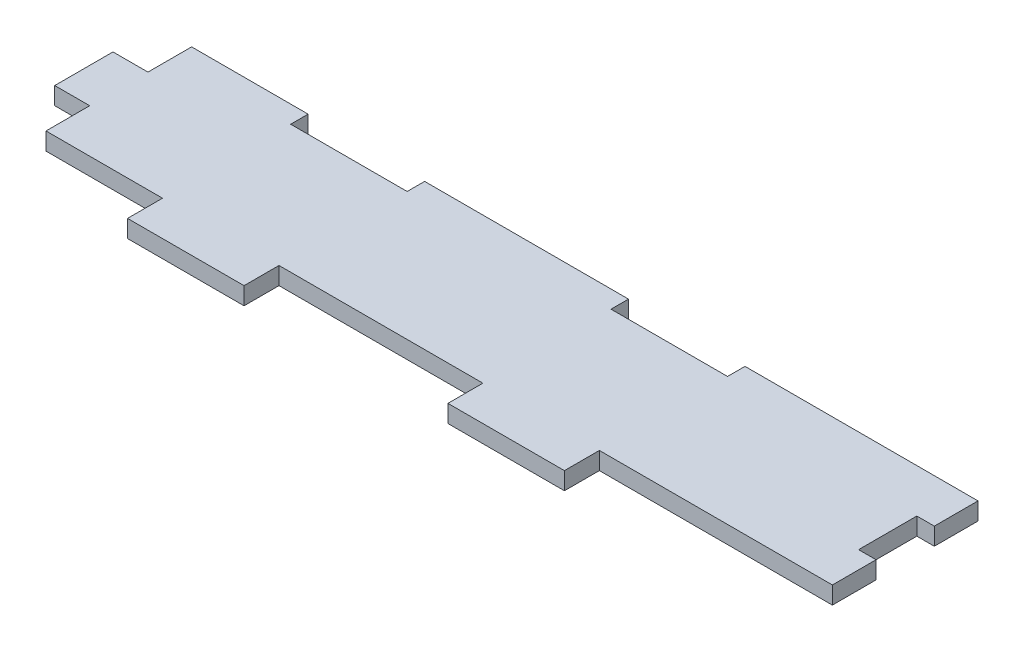
ISO-10303-21;
HEADER;
FILE_DESCRIPTION(('STEP AP214'),'2;1');
FILE_NAME('part.step','',(''),(''),'','','');
FILE_SCHEMA(('AUTOMOTIVE_DESIGN { 1 0 10303 214 1 1 1 1 }'));
ENDSEC;
DATA;
#1=APPLICATION_CONTEXT('core data for automotive mechanical design processes');
#2=APPLICATION_PROTOCOL_DEFINITION('international standard','automotive_design',2000,#1);
#3=PRODUCT_CONTEXT('',#1,'mechanical');
#4=PRODUCT('Part','Part','',(#3));
#5=PRODUCT_RELATED_PRODUCT_CATEGORY('part','',(#4));
#6=PRODUCT_DEFINITION_FORMATION('','',#4);
#7=PRODUCT_DEFINITION_CONTEXT('part definition',#1,'design');
#8=PRODUCT_DEFINITION('design','',#6,#7);
#9=PRODUCT_DEFINITION_SHAPE('','',#8);
#10=(LENGTH_UNIT() NAMED_UNIT(*) SI_UNIT(.MILLI.,.METRE.));
#11=(NAMED_UNIT(*) PLANE_ANGLE_UNIT() SI_UNIT($,.RADIAN.));
#12=(NAMED_UNIT(*) SI_UNIT($,.STERADIAN.) SOLID_ANGLE_UNIT());
#13=UNCERTAINTY_MEASURE_WITH_UNIT(LENGTH_MEASURE(1.E-05),#10,'distance_accuracy_value','');
#14=(GEOMETRIC_REPRESENTATION_CONTEXT(3) GLOBAL_UNCERTAINTY_ASSIGNED_CONTEXT((#13)) GLOBAL_UNIT_ASSIGNED_CONTEXT((#10,
#11,#12)) REPRESENTATION_CONTEXT('',''));
#15=CARTESIAN_POINT('',(0.,0.,0.));
#16=DIRECTION('',(0.,0.,1.));
#17=DIRECTION('',(1.,0.,0.));
#18=AXIS2_PLACEMENT_3D('',#15,#16,#17);
#19=CARTESIAN_POINT('',(0.,3.,0.));
#20=DIRECTION('',(1.,0.,0.));
#21=DIRECTION('',(0.,0.,-1.));
#22=AXIS2_PLACEMENT_3D('',#19,#20,#21);
#23=PLANE('',#22);
#24=DIRECTION('',(0.,0.,1.));
#25=VECTOR('',#24,1.);
#26=CARTESIAN_POINT('',(0.,0.,0.));
#27=LINE('',#26,#25);
#28=CARTESIAN_POINT('',(0.,0.,-7.49999999999998));
#29=VERTEX_POINT('',#28);
#30=CARTESIAN_POINT('',(0.,0.,0.));
#31=VERTEX_POINT('',#30);
#32=EDGE_CURVE('E260',#29,#31,#27,.T.);
#33=ORIENTED_EDGE('',*,*,#32,.T.);
#34=DIRECTION('',(0.,-1.,0.));
#35=VECTOR('',#34,1.);
#36=CARTESIAN_POINT('',(0.,3.,0.));
#37=LINE('',#36,#35);
#38=CARTESIAN_POINT('',(0.,3.,0.));
#39=VERTEX_POINT('',#38);
#40=EDGE_CURVE('E11',#39,#31,#37,.T.);
#41=ORIENTED_EDGE('',*,*,#40,.F.);
#42=DIRECTION('',(0.,0.,1.));
#43=VECTOR('',#42,1.);
#44=CARTESIAN_POINT('',(0.,3.,0.));
#45=LINE('',#44,#43);
#46=CARTESIAN_POINT('',(0.,3.,-7.49999999999998));
#47=VERTEX_POINT('',#46);
#48=EDGE_CURVE('E342',#47,#39,#45,.T.);
#49=ORIENTED_EDGE('',*,*,#48,.F.);
#50=DIRECTION('',(0.,-1.,0.));
#51=VECTOR('',#50,1.);
#52=CARTESIAN_POINT('',(0.,3.,-7.49999999999998));
#53=LINE('',#52,#51);
#54=EDGE_CURVE('E256',#47,#29,#53,.T.);
#55=ORIENTED_EDGE('',*,*,#54,.T.);
#56=EDGE_LOOP('',(#33,#41,#49,#55));
#57=FACE_BOUND('',#56,.T.);
#58=ADVANCED_FACE('F39',(#57),#23,.F.);
#59=CARTESIAN_POINT('',(0.,3.,0.));
#60=DIRECTION('',(0.,0.,-1.));
#61=DIRECTION('',(-1.,0.,0.));
#62=AXIS2_PLACEMENT_3D('',#59,#60,#61);
#63=PLANE('',#62);
#64=DIRECTION('',(1.,0.,0.));
#65=VECTOR('',#64,1.);
#66=CARTESIAN_POINT('',(0.,0.,0.));
#67=LINE('',#66,#65);
#68=CARTESIAN_POINT('',(20.,0.,0.));
#69=VERTEX_POINT('',#68);
#70=EDGE_CURVE('E264',#31,#69,#67,.T.);
#71=ORIENTED_EDGE('',*,*,#70,.T.);
#72=DIRECTION('',(0.,-1.,0.));
#73=VECTOR('',#72,1.);
#74=CARTESIAN_POINT('',(20.,3.,0.));
#75=LINE('',#74,#73);
#76=CARTESIAN_POINT('',(20.,3.,0.));
#77=VERTEX_POINT('',#76);
#78=EDGE_CURVE('E48',#77,#69,#75,.T.);
#79=ORIENTED_EDGE('',*,*,#78,.F.);
#80=DIRECTION('',(1.,0.,0.));
#81=VECTOR('',#80,1.);
#82=CARTESIAN_POINT('',(0.,3.,0.));
#83=LINE('',#82,#81);
#84=EDGE_CURVE('E159',#39,#77,#83,.T.);
#85=ORIENTED_EDGE('',*,*,#84,.F.);
#86=ORIENTED_EDGE('',*,*,#40,.T.);
#87=EDGE_LOOP('',(#71,#79,#85,#86));
#88=FACE_BOUND('',#87,.T.);
#89=ADVANCED_FACE('F548',(#88),#63,.F.);
#90=CARTESIAN_POINT('',(20.,3.,0.));
#91=DIRECTION('',(1.,0.,0.));
#92=DIRECTION('',(0.,0.,-1.));
#93=AXIS2_PLACEMENT_3D('',#90,#91,#92);
#94=PLANE('',#93);
#95=DIRECTION('',(0.,0.,1.));
#96=VECTOR('',#95,1.);
#97=CARTESIAN_POINT('',(20.,0.,0.));
#98=LINE('',#97,#96);
#99=CARTESIAN_POINT('',(20.,0.,6.));
#100=VERTEX_POINT('',#99);
#101=EDGE_CURVE('E267',#69,#100,#98,.T.);
#102=ORIENTED_EDGE('',*,*,#101,.T.);
#103=DIRECTION('',(0.,-1.,0.));
#104=VECTOR('',#103,1.);
#105=CARTESIAN_POINT('',(20.,3.,6.));
#106=LINE('',#105,#104);
#107=CARTESIAN_POINT('',(20.,3.,6.));
#108=VERTEX_POINT('',#107);
#109=EDGE_CURVE('E433',#108,#100,#106,.T.);
#110=ORIENTED_EDGE('',*,*,#109,.F.);
#111=DIRECTION('',(0.,0.,1.));
#112=VECTOR('',#111,1.);
#113=CARTESIAN_POINT('',(20.,3.,0.));
#114=LINE('',#113,#112);
#115=EDGE_CURVE('E443',#77,#108,#114,.T.);
#116=ORIENTED_EDGE('',*,*,#115,.F.);
#117=ORIENTED_EDGE('',*,*,#78,.T.);
#118=EDGE_LOOP('',(#102,#110,#116,#117));
#119=FACE_BOUND('',#118,.T.);
#120=ADVANCED_FACE('F441',(#119),#94,.F.);
#121=CARTESIAN_POINT('',(20.,3.,6.));
#122=DIRECTION('',(0.,0.,-1.));
#123=DIRECTION('',(-1.,0.,0.));
#124=AXIS2_PLACEMENT_3D('',#121,#122,#123);
#125=PLANE('',#124);
#126=DIRECTION('',(1.,0.,0.));
#127=VECTOR('',#126,1.);
#128=CARTESIAN_POINT('',(20.,0.,6.));
#129=LINE('',#128,#127);
#130=CARTESIAN_POINT('',(40.,0.,6.));
#131=VERTEX_POINT('',#130);
#132=EDGE_CURVE('E270',#100,#131,#129,.T.);
#133=ORIENTED_EDGE('',*,*,#132,.T.);
#134=DIRECTION('',(0.,-1.,0.));
#135=VECTOR('',#134,1.);
#136=CARTESIAN_POINT('',(40.,3.,6.));
#137=LINE('',#136,#135);
#138=CARTESIAN_POINT('',(40.,3.,6.));
#139=VERTEX_POINT('',#138);
#140=EDGE_CURVE('E429',#139,#131,#137,.T.);
#141=ORIENTED_EDGE('',*,*,#140,.F.);
#142=DIRECTION('',(1.,0.,0.));
#143=VECTOR('',#142,1.);
#144=CARTESIAN_POINT('',(20.,3.,6.));
#145=LINE('',#144,#143);
#146=EDGE_CURVE('E462',#108,#139,#145,.T.);
#147=ORIENTED_EDGE('',*,*,#146,.F.);
#148=ORIENTED_EDGE('',*,*,#109,.T.);
#149=EDGE_LOOP('',(#133,#141,#147,#148));
#150=FACE_BOUND('',#149,.T.);
#151=ADVANCED_FACE('F452',(#150),#125,.F.);
#152=CARTESIAN_POINT('',(40.,3.,0.));
#153=DIRECTION('',(-1.,0.,0.));
#154=DIRECTION('',(0.,0.,1.));
#155=AXIS2_PLACEMENT_3D('',#152,#153,#154);
#156=PLANE('',#155);
#157=DIRECTION('',(0.,0.,-1.));
#158=VECTOR('',#157,1.);
#159=CARTESIAN_POINT('',(40.,0.,0.));
#160=LINE('',#159,#158);
#161=CARTESIAN_POINT('',(40.,0.,0.));
#162=VERTEX_POINT('',#161);
#163=EDGE_CURVE('E273',#131,#162,#160,.T.);
#164=ORIENTED_EDGE('',*,*,#163,.T.);
#165=DIRECTION('',(0.,-1.,0.));
#166=VECTOR('',#165,1.);
#167=CARTESIAN_POINT('',(40.,3.,0.));
#168=LINE('',#167,#166);
#169=CARTESIAN_POINT('',(40.,3.,0.));
#170=VERTEX_POINT('',#169);
#171=EDGE_CURVE('E425',#170,#162,#168,.T.);
#172=ORIENTED_EDGE('',*,*,#171,.F.);
#173=DIRECTION('',(0.,0.,-1.));
#174=VECTOR('',#173,1.);
#175=CARTESIAN_POINT('',(40.,3.,0.));
#176=LINE('',#175,#174);
#177=EDGE_CURVE('E458',#139,#170,#176,.T.);
#178=ORIENTED_EDGE('',*,*,#177,.F.);
#179=ORIENTED_EDGE('',*,*,#140,.T.);
#180=EDGE_LOOP('',(#164,#172,#178,#179));
#181=FACE_BOUND('',#180,.T.);
#182=ADVANCED_FACE('F456',(#181),#156,.F.);
#183=CARTESIAN_POINT('',(40.,3.,0.));
#184=DIRECTION('',(0.,0.,-1.));
#185=DIRECTION('',(-1.,0.,0.));
#186=AXIS2_PLACEMENT_3D('',#183,#184,#185);
#187=PLANE('',#186);
#188=DIRECTION('',(1.,0.,0.));
#189=VECTOR('',#188,1.);
#190=CARTESIAN_POINT('',(40.,0.,0.));
#191=LINE('',#190,#189);
#192=CARTESIAN_POINT('',(75.,0.,0.));
#193=VERTEX_POINT('',#192);
#194=EDGE_CURVE('E276',#162,#193,#191,.T.);
#195=ORIENTED_EDGE('',*,*,#194,.T.);
#196=DIRECTION('',(0.,-1.,0.));
#197=VECTOR('',#196,1.);
#198=CARTESIAN_POINT('',(75.,3.,0.));
#199=LINE('',#198,#197);
#200=CARTESIAN_POINT('',(75.,3.,0.));
#201=VERTEX_POINT('',#200);
#202=EDGE_CURVE('E421',#201,#193,#199,.T.);
#203=ORIENTED_EDGE('',*,*,#202,.F.);
#204=DIRECTION('',(1.,0.,0.));
#205=VECTOR('',#204,1.);
#206=CARTESIAN_POINT('',(40.,3.,0.));
#207=LINE('',#206,#205);
#208=EDGE_CURVE('E461',#170,#201,#207,.T.);
#209=ORIENTED_EDGE('',*,*,#208,.F.);
#210=ORIENTED_EDGE('',*,*,#171,.T.);
#211=EDGE_LOOP('',(#195,#203,#209,#210));
#212=FACE_BOUND('',#211,.T.);
#213=ADVANCED_FACE('F561',(#212),#187,.F.);
#214=CARTESIAN_POINT('',(75.,3.,0.));
#215=DIRECTION('',(1.,0.,0.));
#216=DIRECTION('',(0.,0.,-1.));
#217=AXIS2_PLACEMENT_3D('',#214,#215,#216);
#218=PLANE('',#217);
#219=DIRECTION('',(0.,0.,1.));
#220=VECTOR('',#219,1.);
#221=CARTESIAN_POINT('',(75.,0.,0.));
#222=LINE('',#221,#220);
#223=CARTESIAN_POINT('',(75.,0.,6.));
#224=VERTEX_POINT('',#223);
#225=EDGE_CURVE('E279',#193,#224,#222,.T.);
#226=ORIENTED_EDGE('',*,*,#225,.T.);
#227=DIRECTION('',(0.,-1.,0.));
#228=VECTOR('',#227,1.);
#229=CARTESIAN_POINT('',(75.,3.,6.));
#230=LINE('',#229,#228);
#231=CARTESIAN_POINT('',(75.,3.,6.));
#232=VERTEX_POINT('',#231);
#233=EDGE_CURVE('E417',#232,#224,#230,.T.);
#234=ORIENTED_EDGE('',*,*,#233,.F.);
#235=DIRECTION('',(0.,0.,1.));
#236=VECTOR('',#235,1.);
#237=CARTESIAN_POINT('',(75.,3.,0.));
#238=LINE('',#237,#236);
#239=EDGE_CURVE('E466',#201,#232,#238,.T.);
#240=ORIENTED_EDGE('',*,*,#239,.F.);
#241=ORIENTED_EDGE('',*,*,#202,.T.);
#242=EDGE_LOOP('',(#226,#234,#240,#241));
#243=FACE_BOUND('',#242,.T.);
#244=ADVANCED_FACE('F564',(#243),#218,.F.);
#245=CARTESIAN_POINT('',(75.,3.,6.));
#246=DIRECTION('',(0.,0.,-1.));
#247=DIRECTION('',(-1.,0.,0.));
#248=AXIS2_PLACEMENT_3D('',#245,#246,#247);
#249=PLANE('',#248);
#250=DIRECTION('',(1.,0.,0.));
#251=VECTOR('',#250,1.);
#252=CARTESIAN_POINT('',(75.,0.,6.));
#253=LINE('',#252,#251);
#254=CARTESIAN_POINT('',(95.,0.,6.));
#255=VERTEX_POINT('',#254);
#256=EDGE_CURVE('E282',#224,#255,#253,.T.);
#257=ORIENTED_EDGE('',*,*,#256,.T.);
#258=DIRECTION('',(0.,-1.,0.));
#259=VECTOR('',#258,1.);
#260=CARTESIAN_POINT('',(95.,3.,6.));
#261=LINE('',#260,#259);
#262=CARTESIAN_POINT('',(95.,3.,6.));
#263=VERTEX_POINT('',#262);
#264=EDGE_CURVE('E413',#263,#255,#261,.T.);
#265=ORIENTED_EDGE('',*,*,#264,.F.);
#266=DIRECTION('',(1.,0.,0.));
#267=VECTOR('',#266,1.);
#268=CARTESIAN_POINT('',(75.,3.,6.));
#269=LINE('',#268,#267);
#270=EDGE_CURVE('E473',#232,#263,#269,.T.);
#271=ORIENTED_EDGE('',*,*,#270,.F.);
#272=ORIENTED_EDGE('',*,*,#233,.T.);
#273=EDGE_LOOP('',(#257,#265,#271,#272));
#274=FACE_BOUND('',#273,.T.);
#275=ADVANCED_FACE('F568',(#274),#249,.F.);
#276=CARTESIAN_POINT('',(95.,3.,0.));
#277=DIRECTION('',(-1.,0.,0.));
#278=DIRECTION('',(0.,0.,1.));
#279=AXIS2_PLACEMENT_3D('',#276,#277,#278);
#280=PLANE('',#279);
#281=DIRECTION('',(0.,0.,-1.));
#282=VECTOR('',#281,1.);
#283=CARTESIAN_POINT('',(95.,0.,0.));
#284=LINE('',#283,#282);
#285=CARTESIAN_POINT('',(95.,0.,0.));
#286=VERTEX_POINT('',#285);
#287=EDGE_CURVE('E285',#255,#286,#284,.T.);
#288=ORIENTED_EDGE('',*,*,#287,.T.);
#289=DIRECTION('',(0.,-1.,0.));
#290=VECTOR('',#289,1.);
#291=CARTESIAN_POINT('',(95.,3.,0.));
#292=LINE('',#291,#290);
#293=CARTESIAN_POINT('',(95.,3.,0.));
#294=VERTEX_POINT('',#293);
#295=EDGE_CURVE('E409',#294,#286,#292,.T.);
#296=ORIENTED_EDGE('',*,*,#295,.F.);
#297=DIRECTION('',(0.,0.,-1.));
#298=VECTOR('',#297,1.);
#299=CARTESIAN_POINT('',(95.,3.,0.));
#300=LINE('',#299,#298);
#301=EDGE_CURVE('E476',#263,#294,#300,.T.);
#302=ORIENTED_EDGE('',*,*,#301,.F.);
#303=ORIENTED_EDGE('',*,*,#264,.T.);
#304=EDGE_LOOP('',(#288,#296,#302,#303));
#305=FACE_BOUND('',#304,.T.);
#306=ADVANCED_FACE('F572',(#305),#280,.F.);
#307=CARTESIAN_POINT('',(95.,3.,0.));
#308=DIRECTION('',(0.,0.,-1.));
#309=DIRECTION('',(-1.,0.,0.));
#310=AXIS2_PLACEMENT_3D('',#307,#308,#309);
#311=PLANE('',#310);
#312=DIRECTION('',(1.,0.,0.));
#313=VECTOR('',#312,1.);
#314=CARTESIAN_POINT('',(95.,0.,0.));
#315=LINE('',#314,#313);
#316=CARTESIAN_POINT('',(135.,0.,0.));
#317=VERTEX_POINT('',#316);
#318=EDGE_CURVE('E288',#286,#317,#315,.T.);
#319=ORIENTED_EDGE('',*,*,#318,.T.);
#320=DIRECTION('',(0.,-1.,0.));
#321=VECTOR('',#320,1.);
#322=CARTESIAN_POINT('',(135.,3.,0.));
#323=LINE('',#322,#321);
#324=CARTESIAN_POINT('',(135.,3.,0.));
#325=VERTEX_POINT('',#324);
#326=EDGE_CURVE('E405',#325,#317,#323,.T.);
#327=ORIENTED_EDGE('',*,*,#326,.F.);
#328=DIRECTION('',(1.,0.,0.));
#329=VECTOR('',#328,1.);
#330=CARTESIAN_POINT('',(95.,3.,0.));
#331=LINE('',#330,#329);
#332=EDGE_CURVE('E479',#294,#325,#331,.T.);
#333=ORIENTED_EDGE('',*,*,#332,.F.);
#334=ORIENTED_EDGE('',*,*,#295,.T.);
#335=EDGE_LOOP('',(#319,#327,#333,#334));
#336=FACE_BOUND('',#335,.T.);
#337=ADVANCED_FACE('F576',(#336),#311,.F.);
#338=CARTESIAN_POINT('',(135.,3.,0.));
#339=DIRECTION('',(-1.,0.,0.));
#340=DIRECTION('',(0.,0.,1.));
#341=AXIS2_PLACEMENT_3D('',#338,#339,#340);
#342=PLANE('',#341);
#343=DIRECTION('',(0.,0.,-1.));
#344=VECTOR('',#343,1.);
#345=CARTESIAN_POINT('',(135.,0.,0.));
#346=LINE('',#345,#344);
#347=CARTESIAN_POINT('',(135.,0.,-7.5));
#348=VERTEX_POINT('',#347);
#349=EDGE_CURVE('E291',#317,#348,#346,.T.);
#350=ORIENTED_EDGE('',*,*,#349,.T.);
#351=DIRECTION('',(0.,-1.,0.));
#352=VECTOR('',#351,1.);
#353=CARTESIAN_POINT('',(135.,3.,-7.5));
#354=LINE('',#353,#352);
#355=CARTESIAN_POINT('',(135.,3.,-7.5));
#356=VERTEX_POINT('',#355);
#357=EDGE_CURVE('E401',#356,#348,#354,.T.);
#358=ORIENTED_EDGE('',*,*,#357,.F.);
#359=DIRECTION('',(0.,0.,-1.));
#360=VECTOR('',#359,1.);
#361=CARTESIAN_POINT('',(135.,3.,0.));
#362=LINE('',#361,#360);
#363=EDGE_CURVE('E482',#325,#356,#362,.T.);
#364=ORIENTED_EDGE('',*,*,#363,.F.);
#365=ORIENTED_EDGE('',*,*,#326,.T.);
#366=EDGE_LOOP('',(#350,#358,#364,#365));
#367=FACE_BOUND('',#366,.T.);
#368=ADVANCED_FACE('F580',(#367),#342,.F.);
#369=CARTESIAN_POINT('',(135.,3.,-7.5));
#370=DIRECTION('',(0.,0.,1.));
#371=DIRECTION('',(1.,0.,0.));
#372=AXIS2_PLACEMENT_3D('',#369,#370,#371);
#373=PLANE('',#372);
#374=DIRECTION('',(-1.,0.,0.));
#375=VECTOR('',#374,1.);
#376=CARTESIAN_POINT('',(135.,0.,-7.5));
#377=LINE('',#376,#375);
#378=CARTESIAN_POINT('',(132.,0.,-7.5));
#379=VERTEX_POINT('',#378);
#380=EDGE_CURVE('E294',#348,#379,#377,.T.);
#381=ORIENTED_EDGE('',*,*,#380,.T.);
#382=DIRECTION('',(0.,-1.,0.));
#383=VECTOR('',#382,1.);
#384=CARTESIAN_POINT('',(132.,3.,-7.5));
#385=LINE('',#384,#383);
#386=CARTESIAN_POINT('',(132.,3.,-7.5));
#387=VERTEX_POINT('',#386);
#388=EDGE_CURVE('E397',#387,#379,#385,.T.);
#389=ORIENTED_EDGE('',*,*,#388,.F.);
#390=DIRECTION('',(-1.,0.,0.));
#391=VECTOR('',#390,1.);
#392=CARTESIAN_POINT('',(135.,3.,-7.5));
#393=LINE('',#392,#391);
#394=EDGE_CURVE('E485',#356,#387,#393,.T.);
#395=ORIENTED_EDGE('',*,*,#394,.F.);
#396=ORIENTED_EDGE('',*,*,#357,.T.);
#397=EDGE_LOOP('',(#381,#389,#395,#396));
#398=FACE_BOUND('',#397,.T.);
#399=ADVANCED_FACE('F584',(#398),#373,.F.);
#400=CARTESIAN_POINT('',(132.,3.,-17.5));
#401=DIRECTION('',(-1.,0.,0.));
#402=DIRECTION('',(0.,0.,1.));
#403=AXIS2_PLACEMENT_3D('',#400,#401,#402);
#404=PLANE('',#403);
#405=DIRECTION('',(0.,0.,-1.));
#406=VECTOR('',#405,1.);
#407=CARTESIAN_POINT('',(132.,0.,-17.5));
#408=LINE('',#407,#406);
#409=CARTESIAN_POINT('',(132.,0.,-17.5));
#410=VERTEX_POINT('',#409);
#411=EDGE_CURVE('E297',#379,#410,#408,.T.);
#412=ORIENTED_EDGE('',*,*,#411,.T.);
#413=DIRECTION('',(0.,-1.,0.));
#414=VECTOR('',#413,1.);
#415=CARTESIAN_POINT('',(132.,3.,-17.5));
#416=LINE('',#415,#414);
#417=CARTESIAN_POINT('',(132.,3.,-17.5));
#418=VERTEX_POINT('',#417);
#419=EDGE_CURVE('E393',#418,#410,#416,.T.);
#420=ORIENTED_EDGE('',*,*,#419,.F.);
#421=DIRECTION('',(0.,0.,-1.));
#422=VECTOR('',#421,1.);
#423=CARTESIAN_POINT('',(132.,3.,-17.5));
#424=LINE('',#423,#422);
#425=EDGE_CURVE('E488',#387,#418,#424,.T.);
#426=ORIENTED_EDGE('',*,*,#425,.F.);
#427=ORIENTED_EDGE('',*,*,#388,.T.);
#428=EDGE_LOOP('',(#412,#420,#426,#427));
#429=FACE_BOUND('',#428,.T.);
#430=ADVANCED_FACE('F588',(#429),#404,.F.);
#431=CARTESIAN_POINT('',(135.,3.,-17.5));
#432=DIRECTION('',(0.,0.,-1.));
#433=DIRECTION('',(-1.,0.,0.));
#434=AXIS2_PLACEMENT_3D('',#431,#432,#433);
#435=PLANE('',#434);
#436=DIRECTION('',(1.,0.,0.));
#437=VECTOR('',#436,1.);
#438=CARTESIAN_POINT('',(135.,0.,-17.5));
#439=LINE('',#438,#437);
#440=CARTESIAN_POINT('',(135.,0.,-17.5));
#441=VERTEX_POINT('',#440);
#442=EDGE_CURVE('E300',#410,#441,#439,.T.);
#443=ORIENTED_EDGE('',*,*,#442,.T.);
#444=DIRECTION('',(0.,-1.,0.));
#445=VECTOR('',#444,1.);
#446=CARTESIAN_POINT('',(135.,3.,-17.5));
#447=LINE('',#446,#445);
#448=CARTESIAN_POINT('',(135.,3.,-17.5));
#449=VERTEX_POINT('',#448);
#450=EDGE_CURVE('E389',#449,#441,#447,.T.);
#451=ORIENTED_EDGE('',*,*,#450,.F.);
#452=DIRECTION('',(1.,0.,0.));
#453=VECTOR('',#452,1.);
#454=CARTESIAN_POINT('',(135.,3.,-17.5));
#455=LINE('',#454,#453);
#456=EDGE_CURVE('E491',#418,#449,#455,.T.);
#457=ORIENTED_EDGE('',*,*,#456,.F.);
#458=ORIENTED_EDGE('',*,*,#419,.T.);
#459=EDGE_LOOP('',(#443,#451,#457,#458));
#460=FACE_BOUND('',#459,.T.);
#461=ADVANCED_FACE('F592',(#460),#435,.F.);
#462=CARTESIAN_POINT('',(135.,3.,-17.5));
#463=DIRECTION('',(-1.,0.,0.));
#464=DIRECTION('',(0.,0.,1.));
#465=AXIS2_PLACEMENT_3D('',#462,#463,#464);
#466=PLANE('',#465);
#467=DIRECTION('',(0.,0.,-1.));
#468=VECTOR('',#467,1.);
#469=CARTESIAN_POINT('',(135.,0.,-17.5));
#470=LINE('',#469,#468);
#471=CARTESIAN_POINT('',(135.,0.,-25.));
#472=VERTEX_POINT('',#471);
#473=EDGE_CURVE('E303',#441,#472,#470,.T.);
#474=ORIENTED_EDGE('',*,*,#473,.T.);
#475=DIRECTION('',(0.,-1.,0.));
#476=VECTOR('',#475,1.);
#477=CARTESIAN_POINT('',(135.,3.,-25.));
#478=LINE('',#477,#476);
#479=CARTESIAN_POINT('',(135.,3.,-25.));
#480=VERTEX_POINT('',#479);
#481=EDGE_CURVE('E385',#480,#472,#478,.T.);
#482=ORIENTED_EDGE('',*,*,#481,.F.);
#483=DIRECTION('',(0.,0.,-1.));
#484=VECTOR('',#483,1.);
#485=CARTESIAN_POINT('',(135.,3.,-17.5));
#486=LINE('',#485,#484);
#487=EDGE_CURVE('E494',#449,#480,#486,.T.);
#488=ORIENTED_EDGE('',*,*,#487,.F.);
#489=ORIENTED_EDGE('',*,*,#450,.T.);
#490=EDGE_LOOP('',(#474,#482,#488,#489));
#491=FACE_BOUND('',#490,.T.);
#492=ADVANCED_FACE('F596',(#491),#466,.F.);
#493=CARTESIAN_POINT('',(95.,3.,-25.));
#494=DIRECTION('',(0.,0.,1.));
#495=DIRECTION('',(1.,0.,0.));
#496=AXIS2_PLACEMENT_3D('',#493,#494,#495);
#497=PLANE('',#496);
#498=DIRECTION('',(-1.,0.,0.));
#499=VECTOR('',#498,1.);
#500=CARTESIAN_POINT('',(95.,0.,-25.));
#501=LINE('',#500,#499);
#502=CARTESIAN_POINT('',(95.,0.,-25.));
#503=VERTEX_POINT('',#502);
#504=EDGE_CURVE('E306',#472,#503,#501,.T.);
#505=ORIENTED_EDGE('',*,*,#504,.T.);
#506=DIRECTION('',(0.,-1.,0.));
#507=VECTOR('',#506,1.);
#508=CARTESIAN_POINT('',(95.,3.,-25.));
#509=LINE('',#508,#507);
#510=CARTESIAN_POINT('',(95.,3.,-25.));
#511=VERTEX_POINT('',#510);
#512=EDGE_CURVE('E381',#511,#503,#509,.T.);
#513=ORIENTED_EDGE('',*,*,#512,.F.);
#514=DIRECTION('',(-1.,0.,0.));
#515=VECTOR('',#514,1.);
#516=CARTESIAN_POINT('',(95.,3.,-25.));
#517=LINE('',#516,#515);
#518=EDGE_CURVE('E497',#480,#511,#517,.T.);
#519=ORIENTED_EDGE('',*,*,#518,.F.);
#520=ORIENTED_EDGE('',*,*,#481,.T.);
#521=EDGE_LOOP('',(#505,#513,#519,#520));
#522=FACE_BOUND('',#521,.T.);
#523=ADVANCED_FACE('F600',(#522),#497,.F.);
#524=CARTESIAN_POINT('',(95.,3.,-25.));
#525=DIRECTION('',(1.,0.,0.));
#526=DIRECTION('',(0.,0.,-1.));
#527=AXIS2_PLACEMENT_3D('',#524,#525,#526);
#528=PLANE('',#527);
#529=DIRECTION('',(0.,0.,1.));
#530=VECTOR('',#529,1.);
#531=CARTESIAN_POINT('',(95.,0.,-25.));
#532=LINE('',#531,#530);
#533=CARTESIAN_POINT('',(95.,0.,-22.));
#534=VERTEX_POINT('',#533);
#535=EDGE_CURVE('E309',#503,#534,#532,.T.);
#536=ORIENTED_EDGE('',*,*,#535,.T.);
#537=DIRECTION('',(0.,-1.,0.));
#538=VECTOR('',#537,1.);
#539=CARTESIAN_POINT('',(95.,3.,-22.));
#540=LINE('',#539,#538);
#541=CARTESIAN_POINT('',(95.,3.,-22.));
#542=VERTEX_POINT('',#541);
#543=EDGE_CURVE('E377',#542,#534,#540,.T.);
#544=ORIENTED_EDGE('',*,*,#543,.F.);
#545=DIRECTION('',(0.,0.,1.));
#546=VECTOR('',#545,1.);
#547=CARTESIAN_POINT('',(95.,3.,-25.));
#548=LINE('',#547,#546);
#549=EDGE_CURVE('E500',#511,#542,#548,.T.);
#550=ORIENTED_EDGE('',*,*,#549,.F.);
#551=ORIENTED_EDGE('',*,*,#512,.T.);
#552=EDGE_LOOP('',(#536,#544,#550,#551));
#553=FACE_BOUND('',#552,.T.);
#554=ADVANCED_FACE('F604',(#553),#528,.F.);
#555=CARTESIAN_POINT('',(75.,3.,-22.));
#556=DIRECTION('',(0.,0.,1.));
#557=DIRECTION('',(1.,0.,0.));
#558=AXIS2_PLACEMENT_3D('',#555,#556,#557);
#559=PLANE('',#558);
#560=DIRECTION('',(-1.,0.,0.));
#561=VECTOR('',#560,1.);
#562=CARTESIAN_POINT('',(75.,0.,-22.));
#563=LINE('',#562,#561);
#564=CARTESIAN_POINT('',(75.,0.,-22.));
#565=VERTEX_POINT('',#564);
#566=EDGE_CURVE('E312',#534,#565,#563,.T.);
#567=ORIENTED_EDGE('',*,*,#566,.T.);
#568=DIRECTION('',(0.,-1.,0.));
#569=VECTOR('',#568,1.);
#570=CARTESIAN_POINT('',(75.,3.,-22.));
#571=LINE('',#570,#569);
#572=CARTESIAN_POINT('',(75.,3.,-22.));
#573=VERTEX_POINT('',#572);
#574=EDGE_CURVE('E373',#573,#565,#571,.T.);
#575=ORIENTED_EDGE('',*,*,#574,.F.);
#576=DIRECTION('',(-1.,0.,0.));
#577=VECTOR('',#576,1.);
#578=CARTESIAN_POINT('',(75.,3.,-22.));
#579=LINE('',#578,#577);
#580=EDGE_CURVE('E503',#542,#573,#579,.T.);
#581=ORIENTED_EDGE('',*,*,#580,.F.);
#582=ORIENTED_EDGE('',*,*,#543,.T.);
#583=EDGE_LOOP('',(#567,#575,#581,#582));
#584=FACE_BOUND('',#583,.T.);
#585=ADVANCED_FACE('F608',(#584),#559,.F.);
#586=CARTESIAN_POINT('',(75.,3.,-25.));
#587=DIRECTION('',(-1.,0.,0.));
#588=DIRECTION('',(0.,0.,1.));
#589=AXIS2_PLACEMENT_3D('',#586,#587,#588);
#590=PLANE('',#589);
#591=DIRECTION('',(0.,0.,-1.));
#592=VECTOR('',#591,1.);
#593=CARTESIAN_POINT('',(75.,0.,-25.));
#594=LINE('',#593,#592);
#595=CARTESIAN_POINT('',(75.,0.,-25.));
#596=VERTEX_POINT('',#595);
#597=EDGE_CURVE('E315',#565,#596,#594,.T.);
#598=ORIENTED_EDGE('',*,*,#597,.T.);
#599=DIRECTION('',(0.,-1.,0.));
#600=VECTOR('',#599,1.);
#601=CARTESIAN_POINT('',(75.,3.,-25.));
#602=LINE('',#601,#600);
#603=CARTESIAN_POINT('',(75.,3.,-25.));
#604=VERTEX_POINT('',#603);
#605=EDGE_CURVE('E369',#604,#596,#602,.T.);
#606=ORIENTED_EDGE('',*,*,#605,.F.);
#607=DIRECTION('',(0.,0.,-1.));
#608=VECTOR('',#607,1.);
#609=CARTESIAN_POINT('',(75.,3.,-25.));
#610=LINE('',#609,#608);
#611=EDGE_CURVE('E506',#573,#604,#610,.T.);
#612=ORIENTED_EDGE('',*,*,#611,.F.);
#613=ORIENTED_EDGE('',*,*,#574,.T.);
#614=EDGE_LOOP('',(#598,#606,#612,#613));
#615=FACE_BOUND('',#614,.T.);
#616=ADVANCED_FACE('F612',(#615),#590,.F.);
#617=CARTESIAN_POINT('',(40.,3.,-25.));
#618=DIRECTION('',(0.,0.,1.));
#619=DIRECTION('',(1.,0.,0.));
#620=AXIS2_PLACEMENT_3D('',#617,#618,#619);
#621=PLANE('',#620);
#622=DIRECTION('',(-1.,0.,0.));
#623=VECTOR('',#622,1.);
#624=CARTESIAN_POINT('',(40.,0.,-25.));
#625=LINE('',#624,#623);
#626=CARTESIAN_POINT('',(40.,0.,-25.));
#627=VERTEX_POINT('',#626);
#628=EDGE_CURVE('E318',#596,#627,#625,.T.);
#629=ORIENTED_EDGE('',*,*,#628,.T.);
#630=DIRECTION('',(0.,-1.,0.));
#631=VECTOR('',#630,1.);
#632=CARTESIAN_POINT('',(40.,3.,-25.));
#633=LINE('',#632,#631);
#634=CARTESIAN_POINT('',(40.,3.,-25.));
#635=VERTEX_POINT('',#634);
#636=EDGE_CURVE('E365',#635,#627,#633,.T.);
#637=ORIENTED_EDGE('',*,*,#636,.F.);
#638=DIRECTION('',(-1.,0.,0.));
#639=VECTOR('',#638,1.);
#640=CARTESIAN_POINT('',(40.,3.,-25.));
#641=LINE('',#640,#639);
#642=EDGE_CURVE('E509',#604,#635,#641,.T.);
#643=ORIENTED_EDGE('',*,*,#642,.F.);
#644=ORIENTED_EDGE('',*,*,#605,.T.);
#645=EDGE_LOOP('',(#629,#637,#643,#644));
#646=FACE_BOUND('',#645,.T.);
#647=ADVANCED_FACE('F616',(#646),#621,.F.);
#648=CARTESIAN_POINT('',(40.,3.,-25.));
#649=DIRECTION('',(1.,0.,0.));
#650=DIRECTION('',(0.,0.,-1.));
#651=AXIS2_PLACEMENT_3D('',#648,#649,#650);
#652=PLANE('',#651);
#653=DIRECTION('',(0.,0.,1.));
#654=VECTOR('',#653,1.);
#655=CARTESIAN_POINT('',(40.,0.,-25.));
#656=LINE('',#655,#654);
#657=CARTESIAN_POINT('',(40.,0.,-22.));
#658=VERTEX_POINT('',#657);
#659=EDGE_CURVE('E321',#627,#658,#656,.T.);
#660=ORIENTED_EDGE('',*,*,#659,.T.);
#661=DIRECTION('',(0.,-1.,0.));
#662=VECTOR('',#661,1.);
#663=CARTESIAN_POINT('',(40.,3.,-22.));
#664=LINE('',#663,#662);
#665=CARTESIAN_POINT('',(40.,3.,-22.));
#666=VERTEX_POINT('',#665);
#667=EDGE_CURVE('E361',#666,#658,#664,.T.);
#668=ORIENTED_EDGE('',*,*,#667,.F.);
#669=DIRECTION('',(0.,0.,1.));
#670=VECTOR('',#669,1.);
#671=CARTESIAN_POINT('',(40.,3.,-25.));
#672=LINE('',#671,#670);
#673=EDGE_CURVE('E512',#635,#666,#672,.T.);
#674=ORIENTED_EDGE('',*,*,#673,.F.);
#675=ORIENTED_EDGE('',*,*,#636,.T.);
#676=EDGE_LOOP('',(#660,#668,#674,#675));
#677=FACE_BOUND('',#676,.T.);
#678=ADVANCED_FACE('F620',(#677),#652,.F.);
#679=CARTESIAN_POINT('',(20.,3.,-22.));
#680=DIRECTION('',(0.,0.,1.));
#681=DIRECTION('',(1.,0.,0.));
#682=AXIS2_PLACEMENT_3D('',#679,#680,#681);
#683=PLANE('',#682);
#684=DIRECTION('',(-1.,0.,0.));
#685=VECTOR('',#684,1.);
#686=CARTESIAN_POINT('',(20.,0.,-22.));
#687=LINE('',#686,#685);
#688=CARTESIAN_POINT('',(20.,0.,-22.));
#689=VERTEX_POINT('',#688);
#690=EDGE_CURVE('E324',#658,#689,#687,.T.);
#691=ORIENTED_EDGE('',*,*,#690,.T.);
#692=DIRECTION('',(0.,-1.,0.));
#693=VECTOR('',#692,1.);
#694=CARTESIAN_POINT('',(20.,3.,-22.));
#695=LINE('',#694,#693);
#696=CARTESIAN_POINT('',(20.,3.,-22.));
#697=VERTEX_POINT('',#696);
#698=EDGE_CURVE('E357',#697,#689,#695,.T.);
#699=ORIENTED_EDGE('',*,*,#698,.F.);
#700=DIRECTION('',(-1.,0.,0.));
#701=VECTOR('',#700,1.);
#702=CARTESIAN_POINT('',(20.,3.,-22.));
#703=LINE('',#702,#701);
#704=EDGE_CURVE('E515',#666,#697,#703,.T.);
#705=ORIENTED_EDGE('',*,*,#704,.F.);
#706=ORIENTED_EDGE('',*,*,#667,.T.);
#707=EDGE_LOOP('',(#691,#699,#705,#706));
#708=FACE_BOUND('',#707,.T.);
#709=ADVANCED_FACE('F624',(#708),#683,.F.);
#710=CARTESIAN_POINT('',(20.,3.,-25.));
#711=DIRECTION('',(-1.,0.,0.));
#712=DIRECTION('',(0.,0.,1.));
#713=AXIS2_PLACEMENT_3D('',#710,#711,#712);
#714=PLANE('',#713);
#715=DIRECTION('',(0.,0.,-1.));
#716=VECTOR('',#715,1.);
#717=CARTESIAN_POINT('',(20.,0.,-25.));
#718=LINE('',#717,#716);
#719=CARTESIAN_POINT('',(20.,0.,-25.));
#720=VERTEX_POINT('',#719);
#721=EDGE_CURVE('E327',#689,#720,#718,.T.);
#722=ORIENTED_EDGE('',*,*,#721,.T.);
#723=DIRECTION('',(0.,-1.,0.));
#724=VECTOR('',#723,1.);
#725=CARTESIAN_POINT('',(20.,3.,-25.));
#726=LINE('',#725,#724);
#727=CARTESIAN_POINT('',(20.,3.,-25.));
#728=VERTEX_POINT('',#727);
#729=EDGE_CURVE('E353',#728,#720,#726,.T.);
#730=ORIENTED_EDGE('',*,*,#729,.F.);
#731=DIRECTION('',(0.,0.,-1.));
#732=VECTOR('',#731,1.);
#733=CARTESIAN_POINT('',(20.,3.,-25.));
#734=LINE('',#733,#732);
#735=EDGE_CURVE('E518',#697,#728,#734,.T.);
#736=ORIENTED_EDGE('',*,*,#735,.F.);
#737=ORIENTED_EDGE('',*,*,#698,.T.);
#738=EDGE_LOOP('',(#722,#730,#736,#737));
#739=FACE_BOUND('',#738,.T.);
#740=ADVANCED_FACE('F628',(#739),#714,.F.);
#741=CARTESIAN_POINT('',(0.,3.,-25.));
#742=DIRECTION('',(0.,0.,1.));
#743=DIRECTION('',(1.,0.,0.));
#744=AXIS2_PLACEMENT_3D('',#741,#742,#743);
#745=PLANE('',#744);
#746=DIRECTION('',(-1.,0.,0.));
#747=VECTOR('',#746,1.);
#748=CARTESIAN_POINT('',(0.,0.,-25.));
#749=LINE('',#748,#747);
#750=CARTESIAN_POINT('',(0.,0.,-25.));
#751=VERTEX_POINT('',#750);
#752=EDGE_CURVE('E330',#720,#751,#749,.T.);
#753=ORIENTED_EDGE('',*,*,#752,.T.);
#754=DIRECTION('',(0.,-1.,0.));
#755=VECTOR('',#754,1.);
#756=CARTESIAN_POINT('',(0.,3.,-25.));
#757=LINE('',#756,#755);
#758=CARTESIAN_POINT('',(0.,3.,-25.));
#759=VERTEX_POINT('',#758);
#760=EDGE_CURVE('E349',#759,#751,#757,.T.);
#761=ORIENTED_EDGE('',*,*,#760,.F.);
#762=DIRECTION('',(-1.,0.,0.));
#763=VECTOR('',#762,1.);
#764=CARTESIAN_POINT('',(0.,3.,-25.));
#765=LINE('',#764,#763);
#766=EDGE_CURVE('E521',#728,#759,#765,.T.);
#767=ORIENTED_EDGE('',*,*,#766,.F.);
#768=ORIENTED_EDGE('',*,*,#729,.T.);
#769=EDGE_LOOP('',(#753,#761,#767,#768));
#770=FACE_BOUND('',#769,.T.);
#771=ADVANCED_FACE('F529',(#770),#745,.F.);
#772=CARTESIAN_POINT('',(0.,3.,-17.5));
#773=DIRECTION('',(1.,0.,0.));
#774=DIRECTION('',(0.,0.,-1.));
#775=AXIS2_PLACEMENT_3D('',#772,#773,#774);
#776=PLANE('',#775);
#777=DIRECTION('',(0.,0.,1.));
#778=VECTOR('',#777,1.);
#779=CARTESIAN_POINT('',(0.,0.,-17.5));
#780=LINE('',#779,#778);
#781=CARTESIAN_POINT('',(0.,0.,-17.5));
#782=VERTEX_POINT('',#781);
#783=EDGE_CURVE('E333',#751,#782,#780,.T.);
#784=ORIENTED_EDGE('',*,*,#783,.T.);
#785=DIRECTION('',(0.,-1.,0.));
#786=VECTOR('',#785,1.);
#787=CARTESIAN_POINT('',(0.,3.,-17.5));
#788=LINE('',#787,#786);
#789=CARTESIAN_POINT('',(0.,3.,-17.5));
#790=VERTEX_POINT('',#789);
#791=EDGE_CURVE('E249',#790,#782,#788,.T.);
#792=ORIENTED_EDGE('',*,*,#791,.F.);
#793=DIRECTION('',(0.,0.,1.));
#794=VECTOR('',#793,1.);
#795=CARTESIAN_POINT('',(0.,3.,-17.5));
#796=LINE('',#795,#794);
#797=EDGE_CURVE('E238',#759,#790,#796,.T.);
#798=ORIENTED_EDGE('',*,*,#797,.F.);
#799=ORIENTED_EDGE('',*,*,#760,.T.);
#800=EDGE_LOOP('',(#784,#792,#798,#799));
#801=FACE_BOUND('',#800,.T.);
#802=ADVANCED_FACE('F533',(#801),#776,.F.);
#803=CARTESIAN_POINT('',(0.,3.,-17.5));
#804=DIRECTION('',(0.,0.,1.));
#805=DIRECTION('',(1.,0.,0.));
#806=AXIS2_PLACEMENT_3D('',#803,#804,#805);
#807=PLANE('',#806);
#808=DIRECTION('',(-1.,0.,0.));
#809=VECTOR('',#808,1.);
#810=CARTESIAN_POINT('',(0.,0.,-17.5));
#811=LINE('',#810,#809);
#812=CARTESIAN_POINT('',(-6.,0.,-17.5));
#813=VERTEX_POINT('',#812);
#814=EDGE_CURVE('E247',#782,#813,#811,.T.);
#815=ORIENTED_EDGE('',*,*,#814,.T.);
#816=DIRECTION('',(0.,-1.,0.));
#817=VECTOR('',#816,1.);
#818=CARTESIAN_POINT('',(-6.,3.,-17.5));
#819=LINE('',#818,#817);
#820=CARTESIAN_POINT('',(-6.,3.,-17.5));
#821=VERTEX_POINT('',#820);
#822=EDGE_CURVE('E244',#821,#813,#819,.T.);
#823=ORIENTED_EDGE('',*,*,#822,.F.);
#824=DIRECTION('',(-1.,0.,0.));
#825=VECTOR('',#824,1.);
#826=CARTESIAN_POINT('',(0.,3.,-17.5));
#827=LINE('',#826,#825);
#828=EDGE_CURVE('E232',#790,#821,#827,.T.);
#829=ORIENTED_EDGE('',*,*,#828,.F.);
#830=ORIENTED_EDGE('',*,*,#791,.T.);
#831=EDGE_LOOP('',(#815,#823,#829,#830));
#832=FACE_BOUND('',#831,.T.);
#833=ADVANCED_FACE('F245',(#832),#807,.F.);
#834=CARTESIAN_POINT('',(-6.,3.,-17.5));
#835=DIRECTION('',(1.,0.,0.));
#836=DIRECTION('',(0.,0.,-1.));
#837=AXIS2_PLACEMENT_3D('',#834,#835,#836);
#838=PLANE('',#837);
#839=DIRECTION('',(0.,0.,1.));
#840=VECTOR('',#839,1.);
#841=CARTESIAN_POINT('',(-6.,0.,-17.5));
#842=LINE('',#841,#840);
#843=CARTESIAN_POINT('',(-6.,0.,-7.49999999999998));
#844=VERTEX_POINT('',#843);
#845=EDGE_CURVE('E145',#813,#844,#842,.T.);
#846=ORIENTED_EDGE('',*,*,#845,.T.);
#847=DIRECTION('',(0.,-1.,0.));
#848=VECTOR('',#847,1.);
#849=CARTESIAN_POINT('',(-6.,3.,-7.49999999999998));
#850=LINE('',#849,#848);
#851=CARTESIAN_POINT('',(-6.,3.,-7.49999999999998));
#852=VERTEX_POINT('',#851);
#853=EDGE_CURVE('E250',#852,#844,#850,.T.);
#854=ORIENTED_EDGE('',*,*,#853,.F.);
#855=DIRECTION('',(0.,0.,1.));
#856=VECTOR('',#855,1.);
#857=CARTESIAN_POINT('',(-6.,3.,-17.5));
#858=LINE('',#857,#856);
#859=EDGE_CURVE('E236',#821,#852,#858,.T.);
#860=ORIENTED_EDGE('',*,*,#859,.F.);
#861=ORIENTED_EDGE('',*,*,#822,.T.);
#862=EDGE_LOOP('',(#846,#854,#860,#861));
#863=FACE_BOUND('',#862,.T.);
#864=ADVANCED_FACE('F252',(#863),#838,.F.);
#865=CARTESIAN_POINT('',(0.,3.,-7.49999999999998));
#866=DIRECTION('',(0.,0.,-1.));
#867=DIRECTION('',(-1.,0.,0.));
#868=AXIS2_PLACEMENT_3D('',#865,#866,#867);
#869=PLANE('',#868);
#870=DIRECTION('',(1.,0.,0.));
#871=VECTOR('',#870,1.);
#872=CARTESIAN_POINT('',(0.,0.,-7.49999999999998));
#873=LINE('',#872,#871);
#874=EDGE_CURVE('E151',#844,#29,#873,.T.);
#875=ORIENTED_EDGE('',*,*,#874,.T.);
#876=ORIENTED_EDGE('',*,*,#54,.F.);
#877=DIRECTION('',(1.,0.,0.));
#878=VECTOR('',#877,1.);
#879=CARTESIAN_POINT('',(0.,3.,-7.49999999999998));
#880=LINE('',#879,#878);
#881=EDGE_CURVE('E56',#852,#47,#880,.T.);
#882=ORIENTED_EDGE('',*,*,#881,.F.);
#883=ORIENTED_EDGE('',*,*,#853,.T.);
#884=EDGE_LOOP('',(#875,#876,#882,#883));
#885=FACE_BOUND('',#884,.T.);
#886=ADVANCED_FACE('F537',(#885),#869,.F.);
#887=CARTESIAN_POINT('',(0.,3.,0.));
#888=DIRECTION('',(0.,1.,0.));
#889=DIRECTION('',(0.,0.,1.));
#890=AXIS2_PLACEMENT_3D('',#887,#888,#889);
#891=PLANE('',#890);
#892=ORIENTED_EDGE('',*,*,#48,.T.);
#893=ORIENTED_EDGE('',*,*,#84,.T.);
#894=ORIENTED_EDGE('',*,*,#115,.T.);
#895=ORIENTED_EDGE('',*,*,#146,.T.);
#896=ORIENTED_EDGE('',*,*,#177,.T.);
#897=ORIENTED_EDGE('',*,*,#208,.T.);
#898=ORIENTED_EDGE('',*,*,#239,.T.);
#899=ORIENTED_EDGE('',*,*,#270,.T.);
#900=ORIENTED_EDGE('',*,*,#301,.T.);
#901=ORIENTED_EDGE('',*,*,#332,.T.);
#902=ORIENTED_EDGE('',*,*,#363,.T.);
#903=ORIENTED_EDGE('',*,*,#394,.T.);
#904=ORIENTED_EDGE('',*,*,#425,.T.);
#905=ORIENTED_EDGE('',*,*,#456,.T.);
#906=ORIENTED_EDGE('',*,*,#487,.T.);
#907=ORIENTED_EDGE('',*,*,#518,.T.);
#908=ORIENTED_EDGE('',*,*,#549,.T.);
#909=ORIENTED_EDGE('',*,*,#580,.T.);
#910=ORIENTED_EDGE('',*,*,#611,.T.);
#911=ORIENTED_EDGE('',*,*,#642,.T.);
#912=ORIENTED_EDGE('',*,*,#673,.T.);
#913=ORIENTED_EDGE('',*,*,#704,.T.);
#914=ORIENTED_EDGE('',*,*,#735,.T.);
#915=ORIENTED_EDGE('',*,*,#766,.T.);
#916=ORIENTED_EDGE('',*,*,#797,.T.);
#917=ORIENTED_EDGE('',*,*,#828,.T.);
#918=ORIENTED_EDGE('',*,*,#859,.T.);
#919=ORIENTED_EDGE('',*,*,#881,.T.);
#920=EDGE_LOOP('',(#892,#893,#894,#895,#896,#897,#898,#899,#900,#901,#902,#903,#904,#905,#906,
#907,#908,#909,#910,#911,#912,#913,#914,#915,#916,#917,#918,#919));
#921=FACE_BOUND('',#920,.T.);
#922=ADVANCED_FACE('F234',(#921),#891,.T.);
#923=CARTESIAN_POINT('',(0.,0.,0.));
#924=DIRECTION('',(0.,1.,0.));
#925=DIRECTION('',(0.,0.,1.));
#926=AXIS2_PLACEMENT_3D('',#923,#924,#925);
#927=PLANE('',#926);
#928=ORIENTED_EDGE('',*,*,#32,.F.);
#929=ORIENTED_EDGE('',*,*,#874,.F.);
#930=ORIENTED_EDGE('',*,*,#845,.F.);
#931=ORIENTED_EDGE('',*,*,#814,.F.);
#932=ORIENTED_EDGE('',*,*,#783,.F.);
#933=ORIENTED_EDGE('',*,*,#752,.F.);
#934=ORIENTED_EDGE('',*,*,#721,.F.);
#935=ORIENTED_EDGE('',*,*,#690,.F.);
#936=ORIENTED_EDGE('',*,*,#659,.F.);
#937=ORIENTED_EDGE('',*,*,#628,.F.);
#938=ORIENTED_EDGE('',*,*,#597,.F.);
#939=ORIENTED_EDGE('',*,*,#566,.F.);
#940=ORIENTED_EDGE('',*,*,#535,.F.);
#941=ORIENTED_EDGE('',*,*,#504,.F.);
#942=ORIENTED_EDGE('',*,*,#473,.F.);
#943=ORIENTED_EDGE('',*,*,#442,.F.);
#944=ORIENTED_EDGE('',*,*,#411,.F.);
#945=ORIENTED_EDGE('',*,*,#380,.F.);
#946=ORIENTED_EDGE('',*,*,#349,.F.);
#947=ORIENTED_EDGE('',*,*,#318,.F.);
#948=ORIENTED_EDGE('',*,*,#287,.F.);
#949=ORIENTED_EDGE('',*,*,#256,.F.);
#950=ORIENTED_EDGE('',*,*,#225,.F.);
#951=ORIENTED_EDGE('',*,*,#194,.F.);
#952=ORIENTED_EDGE('',*,*,#163,.F.);
#953=ORIENTED_EDGE('',*,*,#132,.F.);
#954=ORIENTED_EDGE('',*,*,#101,.F.);
#955=ORIENTED_EDGE('',*,*,#70,.F.);
#956=EDGE_LOOP('',(#928,#929,#930,#931,#932,#933,#934,#935,#936,#937,#938,#939,#940,#941,#942,
#943,#944,#945,#946,#947,#948,#949,#950,#951,#952,#953,#954,#955));
#957=FACE_BOUND('',#956,.T.);
#958=ADVANCED_FACE('F447',(#957),#927,.F.);
#959=CLOSED_SHELL('',(#58,#89,#120,#151,#182,#213,#244,#275,#306,#337,#368,#399,#430,#461,#492,
#523,#554,#585,#616,#647,#678,#709,#740,#771,#802,#833,#864,#886,#922,#958));
#960=MANIFOLD_SOLID_BREP('B2',#959);
#961=ADVANCED_BREP_SHAPE_REPRESENTATION('',(#18,#960),#14);
#962=SHAPE_DEFINITION_REPRESENTATION(#9,#961);
ENDSEC;
END-ISO-10303-21;
